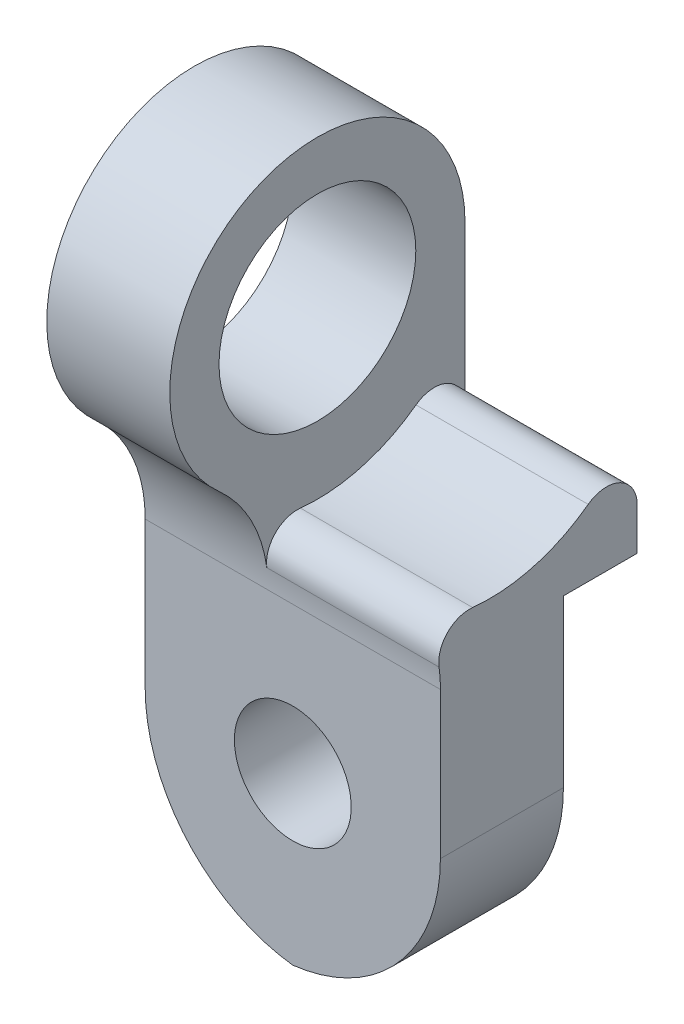
ISO-10303-21;
HEADER;
FILE_DESCRIPTION(('STEP AP214'),'2;1');
FILE_NAME('part.step','',(''),(''),'','','');
FILE_SCHEMA(('AUTOMOTIVE_DESIGN { 1 0 10303 214 1 1 1 1 }'));
ENDSEC;
DATA;
#1=APPLICATION_CONTEXT('core data for automotive mechanical design processes');
#2=APPLICATION_PROTOCOL_DEFINITION('international standard','automotive_design',2000,#1);
#3=PRODUCT_CONTEXT('',#1,'mechanical');
#4=PRODUCT('Part','Part','',(#3));
#5=PRODUCT_RELATED_PRODUCT_CATEGORY('part','',(#4));
#6=PRODUCT_DEFINITION_FORMATION('','',#4);
#7=PRODUCT_DEFINITION_CONTEXT('part definition',#1,'design');
#8=PRODUCT_DEFINITION('design','',#6,#7);
#9=PRODUCT_DEFINITION_SHAPE('','',#8);
#10=(LENGTH_UNIT() NAMED_UNIT(*) SI_UNIT(.MILLI.,.METRE.));
#11=(NAMED_UNIT(*) PLANE_ANGLE_UNIT() SI_UNIT($,.RADIAN.));
#12=(NAMED_UNIT(*) SI_UNIT($,.STERADIAN.) SOLID_ANGLE_UNIT());
#13=UNCERTAINTY_MEASURE_WITH_UNIT(LENGTH_MEASURE(1.E-05),#10,'distance_accuracy_value','');
#14=(GEOMETRIC_REPRESENTATION_CONTEXT(3) GLOBAL_UNCERTAINTY_ASSIGNED_CONTEXT((#13)) GLOBAL_UNIT_ASSIGNED_CONTEXT((#10,
#11,#12)) REPRESENTATION_CONTEXT('',''));
#15=CARTESIAN_POINT('',(0.,0.,0.));
#16=DIRECTION('',(0.,0.,1.));
#17=DIRECTION('',(1.,0.,0.));
#18=AXIS2_PLACEMENT_3D('',#15,#16,#17);
#19=CARTESIAN_POINT('',(-0.5,-4.33,0.4));
#20=DIRECTION('',(0.,0.,-1.));
#21=DIRECTION('',(-1.,0.,0.));
#22=AXIS2_PLACEMENT_3D('',#19,#20,#21);
#23=PLANE('',#22);
#24=CARTESIAN_POINT('',(0.7,-2.98,0.4));
#25=DIRECTION('',(0.,0.,-1.));
#26=DIRECTION('',(-1.,0.,0.));
#27=AXIS2_PLACEMENT_3D('',#24,#25,#26);
#28=CIRCLE('',#27,0.475);
#29=CARTESIAN_POINT('',(0.225,-2.98,0.4));
#30=VERTEX_POINT('',#29);
#31=EDGE_CURVE('E189',#30,#30,#28,.T.);
#32=ORIENTED_EDGE('',*,*,#31,.T.);
#33=EDGE_LOOP('',(#32));
#34=FACE_BOUND('',#33,.T.);
#35=DIRECTION('',(0.,1.,0.));
#36=VECTOR('',#35,1.);
#37=CARTESIAN_POINT('',(-0.5,-4.33,0.4));
#38=LINE('',#37,#36);
#39=CARTESIAN_POINT('',(-0.5,-2.98,0.4));
#40=VERTEX_POINT('',#39);
#41=CARTESIAN_POINT('',(-0.5,-1.78885438199983,0.4));
#42=VERTEX_POINT('',#41);
#43=EDGE_CURVE('E182',#40,#42,#38,.T.);
#44=ORIENTED_EDGE('',*,*,#43,.F.);
#45=CARTESIAN_POINT('',(0.859375,-2.98,0.4));
#46=DIRECTION('',(0.,0.,-1.));
#47=DIRECTION('',(-1.,0.,0.));
#48=AXIS2_PLACEMENT_3D('',#45,#46,#47);
#49=CIRCLE('',#48,1.359375);
#50=CARTESIAN_POINT('',(0.699999999999998,-4.33,0.4));
#51=VERTEX_POINT('',#50);
#52=EDGE_CURVE('E168',#40,#51,#49,.F.);
#53=ORIENTED_EDGE('',*,*,#52,.T.);
#54=CARTESIAN_POINT('',(0.540624999999999,-2.98,0.4));
#55=DIRECTION('',(0.,0.,-1.));
#56=DIRECTION('',(-1.,0.,0.));
#57=AXIS2_PLACEMENT_3D('',#54,#55,#56);
#58=CIRCLE('',#57,1.359375);
#59=CARTESIAN_POINT('',(1.9,-2.98,0.4));
#60=VERTEX_POINT('',#59);
#61=EDGE_CURVE('E173',#60,#51,#58,.T.);
#62=ORIENTED_EDGE('',*,*,#61,.F.);
#63=DIRECTION('',(0.,-1.,0.));
#64=VECTOR('',#63,1.);
#65=CARTESIAN_POINT('',(1.9,-4.33,0.4));
#66=LINE('',#65,#64);
#67=CARTESIAN_POINT('',(1.9,-1.78885438199983,0.4));
#68=VERTEX_POINT('',#67);
#69=EDGE_CURVE('E217',#68,#60,#66,.T.);
#70=ORIENTED_EDGE('',*,*,#69,.F.);
#71=DIRECTION('',(1.,0.,0.));
#72=VECTOR('',#71,1.);
#73=CARTESIAN_POINT('',(-0.5,-1.78885438199983,0.4));
#74=LINE('',#73,#72);
#75=EDGE_CURVE('E245',#42,#68,#74,.T.);
#76=ORIENTED_EDGE('',*,*,#75,.F.);
#77=EDGE_LOOP('',(#44,#53,#62,#70,#76));
#78=FACE_BOUND('',#77,.T.);
#79=ADVANCED_FACE('F79',(#34,#78),#23,.F.);
#80=CARTESIAN_POINT('',(0.,0.,-0.6));
#81=DIRECTION('',(0.,0.,1.));
#82=DIRECTION('',(1.,0.,0.));
#83=AXIS2_PLACEMENT_3D('',#80,#81,#82);
#84=PLANE('',#83);
#85=CARTESIAN_POINT('',(0.7,-2.98,-0.6));
#86=DIRECTION('',(0.,0.,-1.));
#87=DIRECTION('',(-1.,0.,0.));
#88=AXIS2_PLACEMENT_3D('',#85,#86,#87);
#89=CIRCLE('',#88,0.475);
#90=CARTESIAN_POINT('',(0.225,-2.98,-0.6));
#91=VERTEX_POINT('',#90);
#92=EDGE_CURVE('E186',#91,#91,#89,.T.);
#93=ORIENTED_EDGE('',*,*,#92,.F.);
#94=EDGE_LOOP('',(#93));
#95=FACE_BOUND('',#94,.T.);
#96=CARTESIAN_POINT('',(0.540624999999999,-2.98,-0.6));
#97=DIRECTION('',(0.,0.,1.));
#98=DIRECTION('',(1.,0.,0.));
#99=AXIS2_PLACEMENT_3D('',#96,#97,#98);
#100=CIRCLE('',#99,1.359375);
#101=CARTESIAN_POINT('',(0.699999999999998,-4.33,-0.6));
#102=VERTEX_POINT('',#101);
#103=CARTESIAN_POINT('',(1.9,-2.98,-0.6));
#104=VERTEX_POINT('',#103);
#105=EDGE_CURVE('E13',#102,#104,#100,.T.);
#106=ORIENTED_EDGE('',*,*,#105,.F.);
#107=CARTESIAN_POINT('',(0.859375,-2.98,-0.6));
#108=DIRECTION('',(0.,0.,1.));
#109=DIRECTION('',(1.,0.,0.));
#110=AXIS2_PLACEMENT_3D('',#107,#108,#109);
#111=CIRCLE('',#110,1.359375);
#112=CARTESIAN_POINT('',(-0.5,-2.98,-0.6));
#113=VERTEX_POINT('',#112);
#114=EDGE_CURVE('E94',#102,#113,#111,.F.);
#115=ORIENTED_EDGE('',*,*,#114,.T.);
#116=DIRECTION('',(0.,1.,0.));
#117=VECTOR('',#116,1.);
#118=CARTESIAN_POINT('',(-0.5,-4.33,-0.6));
#119=LINE('',#118,#117);
#120=CARTESIAN_POINT('',(-0.5,-1.63,-0.6));
#121=VERTEX_POINT('',#120);
#122=EDGE_CURVE('E198',#113,#121,#119,.T.);
#123=ORIENTED_EDGE('',*,*,#122,.T.);
#124=DIRECTION('',(1.,0.,0.));
#125=VECTOR('',#124,1.);
#126=CARTESIAN_POINT('',(1.9,-1.63,-0.6));
#127=LINE('',#126,#125);
#128=CARTESIAN_POINT('',(1.9,-1.63,-0.6));
#129=VERTEX_POINT('',#128);
#130=EDGE_CURVE('E102',#121,#129,#127,.T.);
#131=ORIENTED_EDGE('',*,*,#130,.T.);
#132=DIRECTION('',(0.,-1.,0.));
#133=VECTOR('',#132,1.);
#134=CARTESIAN_POINT('',(1.9,-4.33,-0.6));
#135=LINE('',#134,#133);
#136=EDGE_CURVE('E196',#129,#104,#135,.T.);
#137=ORIENTED_EDGE('',*,*,#136,.T.);
#138=EDGE_LOOP('',(#106,#115,#123,#131,#137));
#139=FACE_BOUND('',#138,.T.);
#140=ADVANCED_FACE('F311',(#95,#139),#84,.F.);
#141=CARTESIAN_POINT('',(1.9,-1.78885438199983,1.6));
#142=DIRECTION('',(1.,0.,0.));
#143=DIRECTION('',(0.,0.,-1.));
#144=AXIS2_PLACEMENT_3D('',#141,#142,#143);
#145=PLANE('',#144);
#146=ORIENTED_EDGE('',*,*,#69,.T.);
#147=DIRECTION('',(0.,0.,-1.));
#148=VECTOR('',#147,1.);
#149=CARTESIAN_POINT('',(1.9,-2.98,1.2));
#150=LINE('',#149,#148);
#151=EDGE_CURVE('E174',#60,#104,#150,.T.);
#152=ORIENTED_EDGE('',*,*,#151,.T.);
#153=ORIENTED_EDGE('',*,*,#136,.F.);
#154=DIRECTION('',(0.,0.,-1.));
#155=VECTOR('',#154,1.);
#156=CARTESIAN_POINT('',(1.9,-1.63,-0.6));
#157=LINE('',#156,#155);
#158=CARTESIAN_POINT('',(1.9,-1.63,-1.2));
#159=VERTEX_POINT('',#158);
#160=EDGE_CURVE('E203',#129,#159,#157,.T.);
#161=ORIENTED_EDGE('',*,*,#160,.T.);
#162=DIRECTION('',(0.,1.,0.));
#163=VECTOR('',#162,1.);
#164=CARTESIAN_POINT('',(1.9,-0.618465843842649,-1.2));
#165=LINE('',#164,#163);
#166=CARTESIAN_POINT('',(1.9,-1.28743931895837,-1.2));
#167=VERTEX_POINT('',#166);
#168=EDGE_CURVE('E215',#159,#167,#165,.T.);
#169=ORIENTED_EDGE('',*,*,#168,.T.);
#170=CARTESIAN_POINT('',(1.9,-1.28743931895837,-0.95));
#171=DIRECTION('',(1.,0.,0.));
#172=DIRECTION('',(0.,0.,-1.));
#173=AXIS2_PLACEMENT_3D('',#170,#171,#172);
#174=CIRCLE('',#173,0.25);
#175=CARTESIAN_POINT('',(1.9,-1.08627692537113,-0.8015625));
#176=VERTEX_POINT('',#175);
#177=EDGE_CURVE('E256',#167,#176,#174,.T.);
#178=ORIENTED_EDGE('',*,*,#177,.T.);
#179=CARTESIAN_POINT('',(1.9,0.,0.));
#180=DIRECTION('',(1.,0.,0.));
#181=DIRECTION('',(0.,0.,-1.));
#182=AXIS2_PLACEMENT_3D('',#179,#180,#181);
#183=CIRCLE('',#182,1.35);
#184=CARTESIAN_POINT('',(1.9,-1.34293504148559,0.137932861748358));
#185=VERTEX_POINT('',#184);
#186=EDGE_CURVE('E211',#176,#185,#183,.F.);
#187=ORIENTED_EDGE('',*,*,#186,.T.);
#188=CARTESIAN_POINT('',(1.9,-1.59162671583478,0.16347598429435));
#189=DIRECTION('',(1.,0.,0.));
#190=DIRECTION('',(0.,0.,-1.));
#191=AXIS2_PLACEMENT_3D('',#188,#189,#190);
#192=CIRCLE('',#191,0.25);
#193=CARTESIAN_POINT('',(1.9,-1.62563148586323,0.411152538726359));
#194=VERTEX_POINT('',#193);
#195=EDGE_CURVE('E258',#185,#194,#192,.T.);
#196=ORIENTED_EDGE('',*,*,#195,.T.);
#197=CARTESIAN_POINT('',(1.9,-1.78885438199983,1.6));
#198=DIRECTION('',(1.,0.,0.));
#199=DIRECTION('',(0.,0.,-1.));
#200=AXIS2_PLACEMENT_3D('',#197,#198,#199);
#201=CIRCLE('',#200,1.2);
#202=EDGE_CURVE('E210',#194,#68,#201,.F.);
#203=ORIENTED_EDGE('',*,*,#202,.T.);
#204=EDGE_LOOP('',(#146,#152,#153,#161,#169,#178,#187,#196,#203));
#205=FACE_BOUND('',#204,.T.);
#206=ADVANCED_FACE('F295',(#205),#145,.T.);
#207=CARTESIAN_POINT('',(0.5,-1.78885438199983,1.6));
#208=DIRECTION('',(1.,0.,0.));
#209=DIRECTION('',(0.,0.,-1.));
#210=AXIS2_PLACEMENT_3D('',#207,#208,#209);
#211=PLANE('',#210);
#212=CARTESIAN_POINT('',(0.5,0.,0.));
#213=DIRECTION('',(-1.,0.,0.));
#214=DIRECTION('',(0.,0.,1.));
#215=AXIS2_PLACEMENT_3D('',#212,#213,#214);
#216=CIRCLE('',#215,0.8);
#217=CARTESIAN_POINT('',(0.5,0.,0.8));
#218=VERTEX_POINT('',#217);
#219=EDGE_CURVE('E214',#218,#218,#216,.T.);
#220=ORIENTED_EDGE('',*,*,#219,.T.);
#221=EDGE_LOOP('',(#220));
#222=FACE_BOUND('',#221,.T.);
#223=CARTESIAN_POINT('',(0.5,0.,0.));
#224=DIRECTION('',(-1.,0.,0.));
#225=DIRECTION('',(0.,0.,1.));
#226=AXIS2_PLACEMENT_3D('',#223,#224,#225);
#227=CIRCLE('',#226,1.35);
#228=CARTESIAN_POINT('',(0.5,-1.08627692537113,-0.8015625));
#229=VERTEX_POINT('',#228);
#230=CARTESIAN_POINT('',(0.5,-1.34293504148559,0.137932861748358));
#231=VERTEX_POINT('',#230);
#232=EDGE_CURVE('E206',#229,#231,#227,.T.);
#233=ORIENTED_EDGE('',*,*,#232,.F.);
#234=CARTESIAN_POINT('',(0.5,-1.28743931895837,-0.95));
#235=DIRECTION('',(1.,0.,0.));
#236=DIRECTION('',(0.,0.,-1.));
#237=AXIS2_PLACEMENT_3D('',#234,#235,#236);
#238=CIRCLE('',#237,0.25);
#239=CARTESIAN_POINT('',(0.5,-1.28743931895837,-1.2));
#240=VERTEX_POINT('',#239);
#241=EDGE_CURVE('E87',#229,#240,#238,.F.);
#242=ORIENTED_EDGE('',*,*,#241,.T.);
#243=DIRECTION('',(0.,-1.,0.));
#244=VECTOR('',#243,1.);
#245=CARTESIAN_POINT('',(0.5,-4.33,-1.2));
#246=LINE('',#245,#244);
#247=CARTESIAN_POINT('',(0.5,0.,-1.2));
#248=VERTEX_POINT('',#247);
#249=EDGE_CURVE('E228',#248,#240,#246,.T.);
#250=ORIENTED_EDGE('',*,*,#249,.F.);
#251=CARTESIAN_POINT('',(0.5,0.,0.));
#252=DIRECTION('',(-1.,0.,0.));
#253=DIRECTION('',(0.,0.,-1.));
#254=AXIS2_PLACEMENT_3D('',#251,#252,#253);
#255=CIRCLE('',#254,1.2);
#256=CARTESIAN_POINT('',(0.5,-0.894427190999916,0.8));
#257=VERTEX_POINT('',#256);
#258=EDGE_CURVE('E237',#257,#248,#255,.T.);
#259=ORIENTED_EDGE('',*,*,#258,.F.);
#260=CARTESIAN_POINT('',(0.5,-1.78885438199983,1.6));
#261=DIRECTION('',(1.,0.,0.));
#262=DIRECTION('',(0.,0.,-1.));
#263=AXIS2_PLACEMENT_3D('',#260,#261,#262);
#264=CIRCLE('',#263,1.2);
#265=CARTESIAN_POINT('',(0.5,-1.62563148586323,0.411152538726359));
#266=VERTEX_POINT('',#265);
#267=EDGE_CURVE('E223',#266,#257,#264,.T.);
#268=ORIENTED_EDGE('',*,*,#267,.F.);
#269=CARTESIAN_POINT('',(0.5,-1.59162671583478,0.16347598429435));
#270=DIRECTION('',(1.,0.,0.));
#271=DIRECTION('',(0.,0.,-1.));
#272=AXIS2_PLACEMENT_3D('',#269,#270,#271);
#273=CIRCLE('',#272,0.25);
#274=EDGE_CURVE('E263',#266,#231,#273,.F.);
#275=ORIENTED_EDGE('',*,*,#274,.T.);
#276=EDGE_LOOP('',(#233,#242,#250,#259,#268,#275));
#277=FACE_BOUND('',#276,.T.);
#278=ADVANCED_FACE('F269',(#222,#277),#211,.T.);
#279=CARTESIAN_POINT('',(-0.5,-1.78885438199983,1.6));
#280=DIRECTION('',(1.,0.,0.));
#281=DIRECTION('',(0.,0.,-1.));
#282=AXIS2_PLACEMENT_3D('',#279,#280,#281);
#283=PLANE('',#282);
#284=ORIENTED_EDGE('',*,*,#122,.F.);
#285=DIRECTION('',(0.,0.,-1.));
#286=VECTOR('',#285,1.);
#287=CARTESIAN_POINT('',(-0.5,-2.98,1.2));
#288=LINE('',#287,#286);
#289=EDGE_CURVE('E487',#40,#113,#288,.T.);
#290=ORIENTED_EDGE('',*,*,#289,.F.);
#291=ORIENTED_EDGE('',*,*,#43,.T.);
#292=CARTESIAN_POINT('',(-0.5,-1.78885438199983,1.6));
#293=DIRECTION('',(1.,0.,0.));
#294=DIRECTION('',(0.,0.,-1.));
#295=AXIS2_PLACEMENT_3D('',#292,#293,#294);
#296=CIRCLE('',#295,1.2);
#297=CARTESIAN_POINT('',(-0.5,-0.894427190999916,0.8));
#298=VERTEX_POINT('',#297);
#299=EDGE_CURVE('E227',#42,#298,#296,.T.);
#300=ORIENTED_EDGE('',*,*,#299,.T.);
#301=CARTESIAN_POINT('',(-0.5,0.,0.));
#302=DIRECTION('',(-1.,0.,0.));
#303=DIRECTION('',(0.,0.,-1.));
#304=AXIS2_PLACEMENT_3D('',#301,#302,#303);
#305=CIRCLE('',#304,1.2);
#306=CARTESIAN_POINT('',(-0.5,0.,-1.2));
#307=VERTEX_POINT('',#306);
#308=EDGE_CURVE('E230',#298,#307,#305,.T.);
#309=ORIENTED_EDGE('',*,*,#308,.T.);
#310=DIRECTION('',(0.,-1.,0.));
#311=VECTOR('',#310,1.);
#312=CARTESIAN_POINT('',(-0.5,-4.33,-1.2));
#313=LINE('',#312,#311);
#314=CARTESIAN_POINT('',(-0.5,-1.63,-1.2));
#315=VERTEX_POINT('',#314);
#316=EDGE_CURVE('E232',#307,#315,#313,.T.);
#317=ORIENTED_EDGE('',*,*,#316,.T.);
#318=DIRECTION('',(0.,0.,-1.));
#319=VECTOR('',#318,1.);
#320=CARTESIAN_POINT('',(-0.5,-1.63,-0.6));
#321=LINE('',#320,#319);
#322=EDGE_CURVE('E201',#121,#315,#321,.T.);
#323=ORIENTED_EDGE('',*,*,#322,.F.);
#324=EDGE_LOOP('',(#284,#290,#291,#300,#309,#317,#323));
#325=FACE_BOUND('',#324,.T.);
#326=CARTESIAN_POINT('',(-0.5,0.,0.));
#327=DIRECTION('',(-1.,0.,0.));
#328=DIRECTION('',(0.,0.,1.));
#329=AXIS2_PLACEMENT_3D('',#326,#327,#328);
#330=CIRCLE('',#329,0.8);
#331=CARTESIAN_POINT('',(-0.5,0.,0.8));
#332=VERTEX_POINT('',#331);
#333=EDGE_CURVE('E220',#332,#332,#330,.T.);
#334=ORIENTED_EDGE('',*,*,#333,.F.);
#335=EDGE_LOOP('',(#334));
#336=FACE_BOUND('',#335,.T.);
#337=ADVANCED_FACE('F322',(#325,#336),#283,.F.);
#338=CARTESIAN_POINT('',(-0.5,-1.78885438199983,1.6));
#339=DIRECTION('',(1.,0.,0.));
#340=DIRECTION('',(0.,0.,-1.));
#341=AXIS2_PLACEMENT_3D('',#338,#339,#340);
#342=CYLINDRICAL_SURFACE('',#341,1.2);
#343=ORIENTED_EDGE('',*,*,#202,.F.);
#344=DIRECTION('',(1.,0.,0.));
#345=VECTOR('',#344,1.);
#346=CARTESIAN_POINT('',(-0.5,-1.62563148586323,0.411152538726359));
#347=LINE('',#346,#345);
#348=EDGE_CURVE('E248',#194,#266,#347,.F.);
#349=ORIENTED_EDGE('',*,*,#348,.T.);
#350=ORIENTED_EDGE('',*,*,#267,.T.);
#351=DIRECTION('',(1.,0.,0.));
#352=VECTOR('',#351,1.);
#353=CARTESIAN_POINT('',(-0.5,-0.894427190999916,0.8));
#354=LINE('',#353,#352);
#355=EDGE_CURVE('E242',#298,#257,#354,.T.);
#356=ORIENTED_EDGE('',*,*,#355,.F.);
#357=ORIENTED_EDGE('',*,*,#299,.F.);
#358=ORIENTED_EDGE('',*,*,#75,.T.);
#359=EDGE_LOOP('',(#343,#349,#350,#356,#357,#358));
#360=FACE_BOUND('',#359,.T.);
#361=ADVANCED_FACE('F292',(#360),#342,.F.);
#362=CARTESIAN_POINT('',(-0.5,0.,0.));
#363=DIRECTION('',(1.,0.,0.));
#364=DIRECTION('',(0.,0.,-1.));
#365=AXIS2_PLACEMENT_3D('',#362,#363,#364);
#366=CYLINDRICAL_SURFACE('',#365,1.2);
#367=ORIENTED_EDGE('',*,*,#258,.T.);
#368=DIRECTION('',(1.,0.,0.));
#369=VECTOR('',#368,1.);
#370=CARTESIAN_POINT('',(-0.5,0.,-1.2));
#371=LINE('',#370,#369);
#372=EDGE_CURVE('E235',#307,#248,#371,.T.);
#373=ORIENTED_EDGE('',*,*,#372,.F.);
#374=ORIENTED_EDGE('',*,*,#308,.F.);
#375=ORIENTED_EDGE('',*,*,#355,.T.);
#376=EDGE_LOOP('',(#367,#373,#374,#375));
#377=FACE_BOUND('',#376,.T.);
#378=ADVANCED_FACE('F282',(#377),#366,.T.);
#379=CARTESIAN_POINT('',(-0.5,-4.33,-1.2));
#380=DIRECTION('',(0.,0.,1.));
#381=DIRECTION('',(1.,0.,0.));
#382=AXIS2_PLACEMENT_3D('',#379,#380,#381);
#383=PLANE('',#382);
#384=ORIENTED_EDGE('',*,*,#168,.F.);
#385=DIRECTION('',(1.,0.,0.));
#386=VECTOR('',#385,1.);
#387=CARTESIAN_POINT('',(1.9,-1.63,-1.2));
#388=LINE('',#387,#386);
#389=EDGE_CURVE('E195',#315,#159,#388,.T.);
#390=ORIENTED_EDGE('',*,*,#389,.F.);
#391=ORIENTED_EDGE('',*,*,#316,.F.);
#392=ORIENTED_EDGE('',*,*,#372,.T.);
#393=ORIENTED_EDGE('',*,*,#249,.T.);
#394=DIRECTION('',(-1.,0.,0.));
#395=VECTOR('',#394,1.);
#396=CARTESIAN_POINT('',(-0.5,-1.28743931895837,-1.2));
#397=LINE('',#396,#395);
#398=EDGE_CURVE('E260',#240,#167,#397,.F.);
#399=ORIENTED_EDGE('',*,*,#398,.T.);
#400=EDGE_LOOP('',(#384,#390,#391,#392,#393,#399));
#401=FACE_BOUND('',#400,.T.);
#402=ADVANCED_FACE('F276',(#401),#383,.F.);
#403=CARTESIAN_POINT('',(-0.5,0.,0.));
#404=DIRECTION('',(1.,0.,0.));
#405=DIRECTION('',(0.,0.,-1.));
#406=AXIS2_PLACEMENT_3D('',#403,#404,#405);
#407=CYLINDRICAL_SURFACE('',#406,0.8);
#408=ORIENTED_EDGE('',*,*,#333,.T.);
#409=EDGE_LOOP('',(#408));
#410=FACE_BOUND('',#409,.T.);
#411=ORIENTED_EDGE('',*,*,#219,.F.);
#412=EDGE_LOOP('',(#411));
#413=FACE_BOUND('',#412,.T.);
#414=ADVANCED_FACE('F300',(#410,#413),#407,.F.);
#415=CARTESIAN_POINT('',(8.39603037274554,0.,0.));
#416=DIRECTION('',(-1.,0.,0.));
#417=DIRECTION('',(0.,0.,1.));
#418=AXIS2_PLACEMENT_3D('',#415,#416,#417);
#419=CYLINDRICAL_SURFACE('',#418,1.35);
#420=ORIENTED_EDGE('',*,*,#232,.T.);
#421=DIRECTION('',(-1.,0.,0.));
#422=VECTOR('',#421,1.);
#423=CARTESIAN_POINT('',(8.39603037274554,-1.34293504148559,0.137932861748358));
#424=LINE('',#423,#422);
#425=EDGE_CURVE('E254',#231,#185,#424,.F.);
#426=ORIENTED_EDGE('',*,*,#425,.T.);
#427=ORIENTED_EDGE('',*,*,#186,.F.);
#428=DIRECTION('',(-1.,0.,0.));
#429=VECTOR('',#428,1.);
#430=CARTESIAN_POINT('',(8.39603037274554,-1.08627692537113,-0.801562500000001));
#431=LINE('',#430,#429);
#432=EDGE_CURVE('E251',#176,#229,#431,.T.);
#433=ORIENTED_EDGE('',*,*,#432,.T.);
#434=EDGE_LOOP('',(#420,#426,#427,#433));
#435=FACE_BOUND('',#434,.T.);
#436=ADVANCED_FACE('F298',(#435),#419,.F.);
#437=CARTESIAN_POINT('',(8.39603037274554,-1.59162671583478,0.16347598429435));
#438=DIRECTION('',(-1.,0.,0.));
#439=DIRECTION('',(0.,0.,1.));
#440=AXIS2_PLACEMENT_3D('',#437,#438,#439);
#441=CYLINDRICAL_SURFACE('',#440,0.25);
#442=ORIENTED_EDGE('',*,*,#195,.F.);
#443=ORIENTED_EDGE('',*,*,#425,.F.);
#444=ORIENTED_EDGE('',*,*,#274,.F.);
#445=ORIENTED_EDGE('',*,*,#348,.F.);
#446=EDGE_LOOP('',(#442,#443,#444,#445));
#447=FACE_BOUND('',#446,.T.);
#448=ADVANCED_FACE('F290',(#447),#441,.T.);
#449=CARTESIAN_POINT('',(8.39603037274554,-1.28743931895837,-0.95));
#450=DIRECTION('',(-1.,0.,0.));
#451=DIRECTION('',(0.,0.,1.));
#452=AXIS2_PLACEMENT_3D('',#449,#450,#451);
#453=CYLINDRICAL_SURFACE('',#452,0.25);
#454=ORIENTED_EDGE('',*,*,#177,.F.);
#455=ORIENTED_EDGE('',*,*,#398,.F.);
#456=ORIENTED_EDGE('',*,*,#241,.F.);
#457=ORIENTED_EDGE('',*,*,#432,.F.);
#458=EDGE_LOOP('',(#454,#455,#456,#457));
#459=FACE_BOUND('',#458,.T.);
#460=ADVANCED_FACE('F81',(#459),#453,.T.);
#461=CARTESIAN_POINT('',(1.9,-1.63,-0.6));
#462=DIRECTION('',(0.,1.,0.));
#463=DIRECTION('',(0.,0.,1.));
#464=AXIS2_PLACEMENT_3D('',#461,#462,#463);
#465=PLANE('',#464);
#466=ORIENTED_EDGE('',*,*,#389,.T.);
#467=ORIENTED_EDGE('',*,*,#160,.F.);
#468=ORIENTED_EDGE('',*,*,#130,.F.);
#469=ORIENTED_EDGE('',*,*,#322,.T.);
#470=EDGE_LOOP('',(#466,#467,#468,#469));
#471=FACE_BOUND('',#470,.T.);
#472=ADVANCED_FACE('F408',(#471),#465,.F.);
#473=CARTESIAN_POINT('',(0.7,-2.98,-0.6));
#474=DIRECTION('',(0.,0.,-1.));
#475=DIRECTION('',(-1.,0.,0.));
#476=AXIS2_PLACEMENT_3D('',#473,#474,#475);
#477=CYLINDRICAL_SURFACE('',#476,0.475);
#478=ORIENTED_EDGE('',*,*,#92,.T.);
#479=EDGE_LOOP('',(#478));
#480=FACE_BOUND('',#479,.T.);
#481=ORIENTED_EDGE('',*,*,#31,.F.);
#482=EDGE_LOOP('',(#481));
#483=FACE_BOUND('',#482,.T.);
#484=ADVANCED_FACE('F419',(#480,#483),#477,.F.);
#485=CARTESIAN_POINT('',(0.540624999999999,-2.98,1.2));
#486=DIRECTION('',(0.,0.,-1.));
#487=DIRECTION('',(-1.,0.,0.));
#488=AXIS2_PLACEMENT_3D('',#485,#486,#487);
#489=CYLINDRICAL_SURFACE('',#488,1.359375);
#490=ORIENTED_EDGE('',*,*,#61,.T.);
#491=DIRECTION('',(0.,0.,-1.));
#492=VECTOR('',#491,1.);
#493=CARTESIAN_POINT('',(0.699999999999998,-4.33,1.2));
#494=LINE('',#493,#492);
#495=EDGE_CURVE('E165',#51,#102,#494,.T.);
#496=ORIENTED_EDGE('',*,*,#495,.T.);
#497=ORIENTED_EDGE('',*,*,#105,.T.);
#498=ORIENTED_EDGE('',*,*,#151,.F.);
#499=EDGE_LOOP('',(#490,#496,#497,#498));
#500=FACE_BOUND('',#499,.T.);
#501=ADVANCED_FACE('F184',(#500),#489,.T.);
#502=CARTESIAN_POINT('',(0.859375,-2.98,1.2));
#503=DIRECTION('',(0.,0.,-1.));
#504=DIRECTION('',(-1.,0.,0.));
#505=AXIS2_PLACEMENT_3D('',#502,#503,#504);
#506=CYLINDRICAL_SURFACE('',#505,1.359375);
#507=ORIENTED_EDGE('',*,*,#289,.T.);
#508=ORIENTED_EDGE('',*,*,#114,.F.);
#509=ORIENTED_EDGE('',*,*,#495,.F.);
#510=ORIENTED_EDGE('',*,*,#52,.F.);
#511=EDGE_LOOP('',(#507,#508,#509,#510));
#512=FACE_BOUND('',#511,.T.);
#513=ADVANCED_FACE('F167',(#512),#506,.T.);
#514=CLOSED_SHELL('',(#79,#140,#206,#278,#337,#361,#378,#402,#414,#436,#448,#460,#472,#484,#501,#513));
#515=MANIFOLD_SOLID_BREP('B2',#514);
#516=ADVANCED_BREP_SHAPE_REPRESENTATION('',(#18,#515),#14);
#517=SHAPE_DEFINITION_REPRESENTATION(#9,#516);
ENDSEC;
END-ISO-10303-21;
